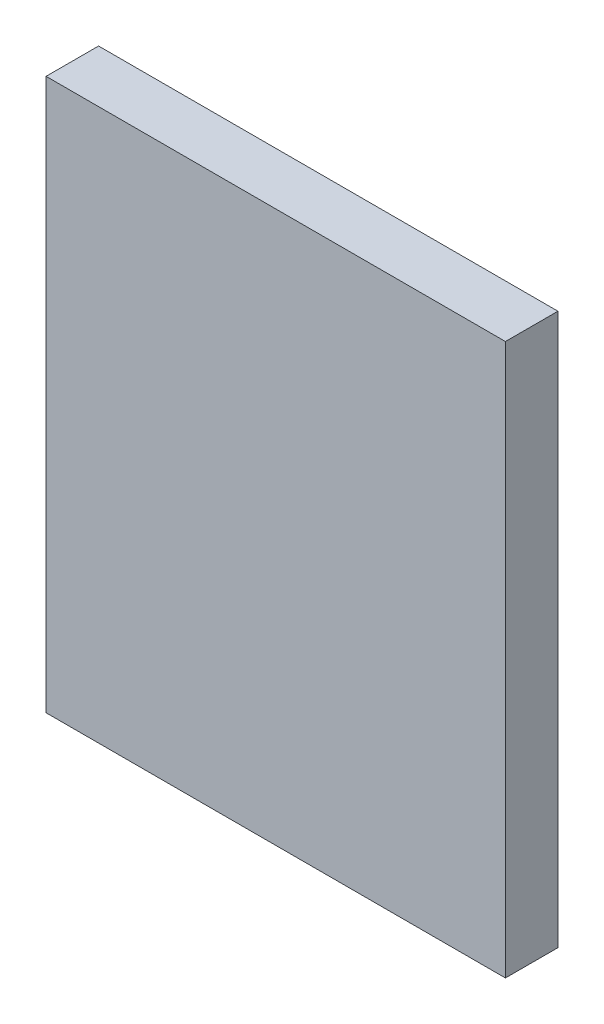
ISO-10303-21;
HEADER;
FILE_DESCRIPTION(('STEP AP214'),'2;1');
FILE_NAME('part.step','',(''),(''),'','','');
FILE_SCHEMA(('AUTOMOTIVE_DESIGN { 1 0 10303 214 1 1 1 1 }'));
ENDSEC;
DATA;
#1=APPLICATION_CONTEXT('core data for automotive mechanical design processes');
#2=APPLICATION_PROTOCOL_DEFINITION('international standard','automotive_design',2000,#1);
#3=PRODUCT_CONTEXT('',#1,'mechanical');
#4=PRODUCT('Part','Part','',(#3));
#5=PRODUCT_RELATED_PRODUCT_CATEGORY('part','',(#4));
#6=PRODUCT_DEFINITION_FORMATION('','',#4);
#7=PRODUCT_DEFINITION_CONTEXT('part definition',#1,'design');
#8=PRODUCT_DEFINITION('design','',#6,#7);
#9=PRODUCT_DEFINITION_SHAPE('','',#8);
#10=(LENGTH_UNIT() NAMED_UNIT(*) SI_UNIT(.MILLI.,.METRE.));
#11=(NAMED_UNIT(*) PLANE_ANGLE_UNIT() SI_UNIT($,.RADIAN.));
#12=(NAMED_UNIT(*) SI_UNIT($,.STERADIAN.) SOLID_ANGLE_UNIT());
#13=UNCERTAINTY_MEASURE_WITH_UNIT(LENGTH_MEASURE(1.E-05),#10,'distance_accuracy_value','');
#14=(GEOMETRIC_REPRESENTATION_CONTEXT(3) GLOBAL_UNCERTAINTY_ASSIGNED_CONTEXT((#13)) GLOBAL_UNIT_ASSIGNED_CONTEXT((#10,
#11,#12)) REPRESENTATION_CONTEXT('',''));
#15=CARTESIAN_POINT('',(0.,0.,0.));
#16=DIRECTION('',(0.,0.,1.));
#17=DIRECTION('',(1.,0.,0.));
#18=AXIS2_PLACEMENT_3D('',#15,#16,#17);
#19=CARTESIAN_POINT('',(0.,0.,4.));
#20=DIRECTION('',(1.,0.,0.));
#21=DIRECTION('',(0.,0.,-1.));
#22=AXIS2_PLACEMENT_3D('',#19,#20,#21);
#23=PLANE('',#22);
#24=DIRECTION('',(0.,-1.,0.));
#25=VECTOR('',#24,1.);
#26=CARTESIAN_POINT('',(0.,0.,0.));
#27=LINE('',#26,#25);
#28=CARTESIAN_POINT('',(0.,0.,0.));
#29=VERTEX_POINT('',#28);
#30=CARTESIAN_POINT('',(0.,-42.,0.));
#31=VERTEX_POINT('',#30);
#32=EDGE_CURVE('E113',#29,#31,#27,.T.);
#33=ORIENTED_EDGE('',*,*,#32,.T.);
#34=DIRECTION('',(0.,0.,-1.));
#35=VECTOR('',#34,1.);
#36=CARTESIAN_POINT('',(0.,-42.,4.));
#37=LINE('',#36,#35);
#38=CARTESIAN_POINT('',(0.,-42.,4.));
#39=VERTEX_POINT('',#38);
#40=EDGE_CURVE('E11',#39,#31,#37,.T.);
#41=ORIENTED_EDGE('',*,*,#40,.F.);
#42=DIRECTION('',(0.,-1.,0.));
#43=VECTOR('',#42,1.);
#44=CARTESIAN_POINT('',(0.,0.,4.));
#45=LINE('',#44,#43);
#46=CARTESIAN_POINT('',(0.,0.,4.));
#47=VERTEX_POINT('',#46);
#48=EDGE_CURVE('E97',#47,#39,#45,.T.);
#49=ORIENTED_EDGE('',*,*,#48,.F.);
#50=DIRECTION('',(0.,0.,-1.));
#51=VECTOR('',#50,1.);
#52=CARTESIAN_POINT('',(0.,0.,4.));
#53=LINE('',#52,#51);
#54=EDGE_CURVE('E109',#47,#29,#53,.T.);
#55=ORIENTED_EDGE('',*,*,#54,.T.);
#56=EDGE_LOOP('',(#33,#41,#49,#55));
#57=FACE_BOUND('',#56,.T.);
#58=ADVANCED_FACE('F45',(#57),#23,.F.);
#59=CARTESIAN_POINT('',(0.,-42.,4.));
#60=DIRECTION('',(0.,1.,0.));
#61=DIRECTION('',(0.,0.,1.));
#62=AXIS2_PLACEMENT_3D('',#59,#60,#61);
#63=PLANE('',#62);
#64=DIRECTION('',(1.,0.,0.));
#65=VECTOR('',#64,1.);
#66=CARTESIAN_POINT('',(0.,-42.,0.));
#67=LINE('',#66,#65);
#68=CARTESIAN_POINT('',(35.,-42.,0.));
#69=VERTEX_POINT('',#68);
#70=EDGE_CURVE('E102',#31,#69,#67,.T.);
#71=ORIENTED_EDGE('',*,*,#70,.T.);
#72=DIRECTION('',(0.,0.,-1.));
#73=VECTOR('',#72,1.);
#74=CARTESIAN_POINT('',(35.,-42.,4.));
#75=LINE('',#74,#73);
#76=CARTESIAN_POINT('',(35.,-42.,4.));
#77=VERTEX_POINT('',#76);
#78=EDGE_CURVE('E54',#77,#69,#75,.T.);
#79=ORIENTED_EDGE('',*,*,#78,.F.);
#80=DIRECTION('',(1.,0.,0.));
#81=VECTOR('',#80,1.);
#82=CARTESIAN_POINT('',(0.,-42.,4.));
#83=LINE('',#82,#81);
#84=EDGE_CURVE('E92',#39,#77,#83,.T.);
#85=ORIENTED_EDGE('',*,*,#84,.F.);
#86=ORIENTED_EDGE('',*,*,#40,.T.);
#87=EDGE_LOOP('',(#71,#79,#85,#86));
#88=FACE_BOUND('',#87,.T.);
#89=ADVANCED_FACE('F101',(#88),#63,.F.);
#90=CARTESIAN_POINT('',(35.,0.,4.));
#91=DIRECTION('',(-1.,0.,0.));
#92=DIRECTION('',(0.,-1.,0.));
#93=AXIS2_PLACEMENT_3D('',#90,#91,#92);
#94=PLANE('',#93);
#95=DIRECTION('',(0.,1.,0.));
#96=VECTOR('',#95,1.);
#97=CARTESIAN_POINT('',(35.,0.,0.));
#98=LINE('',#97,#96);
#99=CARTESIAN_POINT('',(35.,0.,0.));
#100=VERTEX_POINT('',#99);
#101=EDGE_CURVE('E79',#69,#100,#98,.T.);
#102=ORIENTED_EDGE('',*,*,#101,.T.);
#103=DIRECTION('',(0.,0.,-1.));
#104=VECTOR('',#103,1.);
#105=CARTESIAN_POINT('',(35.,0.,4.));
#106=LINE('',#105,#104);
#107=CARTESIAN_POINT('',(35.,0.,4.));
#108=VERTEX_POINT('',#107);
#109=EDGE_CURVE('E104',#108,#100,#106,.T.);
#110=ORIENTED_EDGE('',*,*,#109,.F.);
#111=DIRECTION('',(0.,1.,0.));
#112=VECTOR('',#111,1.);
#113=CARTESIAN_POINT('',(35.,0.,4.));
#114=LINE('',#113,#112);
#115=EDGE_CURVE('E95',#77,#108,#114,.T.);
#116=ORIENTED_EDGE('',*,*,#115,.F.);
#117=ORIENTED_EDGE('',*,*,#78,.T.);
#118=EDGE_LOOP('',(#102,#110,#116,#117));
#119=FACE_BOUND('',#118,.T.);
#120=ADVANCED_FACE('F105',(#119),#94,.F.);
#121=CARTESIAN_POINT('',(0.,0.,4.));
#122=DIRECTION('',(0.,-1.,0.));
#123=DIRECTION('',(0.,0.,-1.));
#124=AXIS2_PLACEMENT_3D('',#121,#122,#123);
#125=PLANE('',#124);
#126=DIRECTION('',(-1.,0.,0.));
#127=VECTOR('',#126,1.);
#128=CARTESIAN_POINT('',(0.,0.,0.));
#129=LINE('',#128,#127);
#130=EDGE_CURVE('E85',#100,#29,#129,.T.);
#131=ORIENTED_EDGE('',*,*,#130,.T.);
#132=ORIENTED_EDGE('',*,*,#54,.F.);
#133=DIRECTION('',(-1.,0.,0.));
#134=VECTOR('',#133,1.);
#135=CARTESIAN_POINT('',(0.,0.,4.));
#136=LINE('',#135,#134);
#137=EDGE_CURVE('E62',#108,#47,#136,.T.);
#138=ORIENTED_EDGE('',*,*,#137,.F.);
#139=ORIENTED_EDGE('',*,*,#109,.T.);
#140=EDGE_LOOP('',(#131,#132,#138,#139));
#141=FACE_BOUND('',#140,.T.);
#142=ADVANCED_FACE('F126',(#141),#125,.F.);
#143=CARTESIAN_POINT('',(0.,0.,4.));
#144=DIRECTION('',(0.,0.,1.));
#145=DIRECTION('',(1.,0.,0.));
#146=AXIS2_PLACEMENT_3D('',#143,#144,#145);
#147=PLANE('',#146);
#148=ORIENTED_EDGE('',*,*,#48,.T.);
#149=ORIENTED_EDGE('',*,*,#84,.T.);
#150=ORIENTED_EDGE('',*,*,#115,.T.);
#151=ORIENTED_EDGE('',*,*,#137,.T.);
#152=EDGE_LOOP('',(#148,#149,#150,#151));
#153=FACE_BOUND('',#152,.T.);
#154=ADVANCED_FACE('F93',(#153),#147,.T.);
#155=CARTESIAN_POINT('',(0.,0.,0.));
#156=DIRECTION('',(0.,0.,1.));
#157=DIRECTION('',(1.,0.,0.));
#158=AXIS2_PLACEMENT_3D('',#155,#156,#157);
#159=PLANE('',#158);
#160=ORIENTED_EDGE('',*,*,#32,.F.);
#161=ORIENTED_EDGE('',*,*,#130,.F.);
#162=ORIENTED_EDGE('',*,*,#101,.F.);
#163=ORIENTED_EDGE('',*,*,#70,.F.);
#164=EDGE_LOOP('',(#160,#161,#162,#163));
#165=FACE_BOUND('',#164,.T.);
#166=ADVANCED_FACE('F129',(#165),#159,.F.);
#167=CLOSED_SHELL('',(#58,#89,#120,#142,#154,#166));
#168=MANIFOLD_SOLID_BREP('B2',#167);
#169=ADVANCED_BREP_SHAPE_REPRESENTATION('',(#18,#168),#14);
#170=SHAPE_DEFINITION_REPRESENTATION(#9,#169);
ENDSEC;
END-ISO-10303-21;
